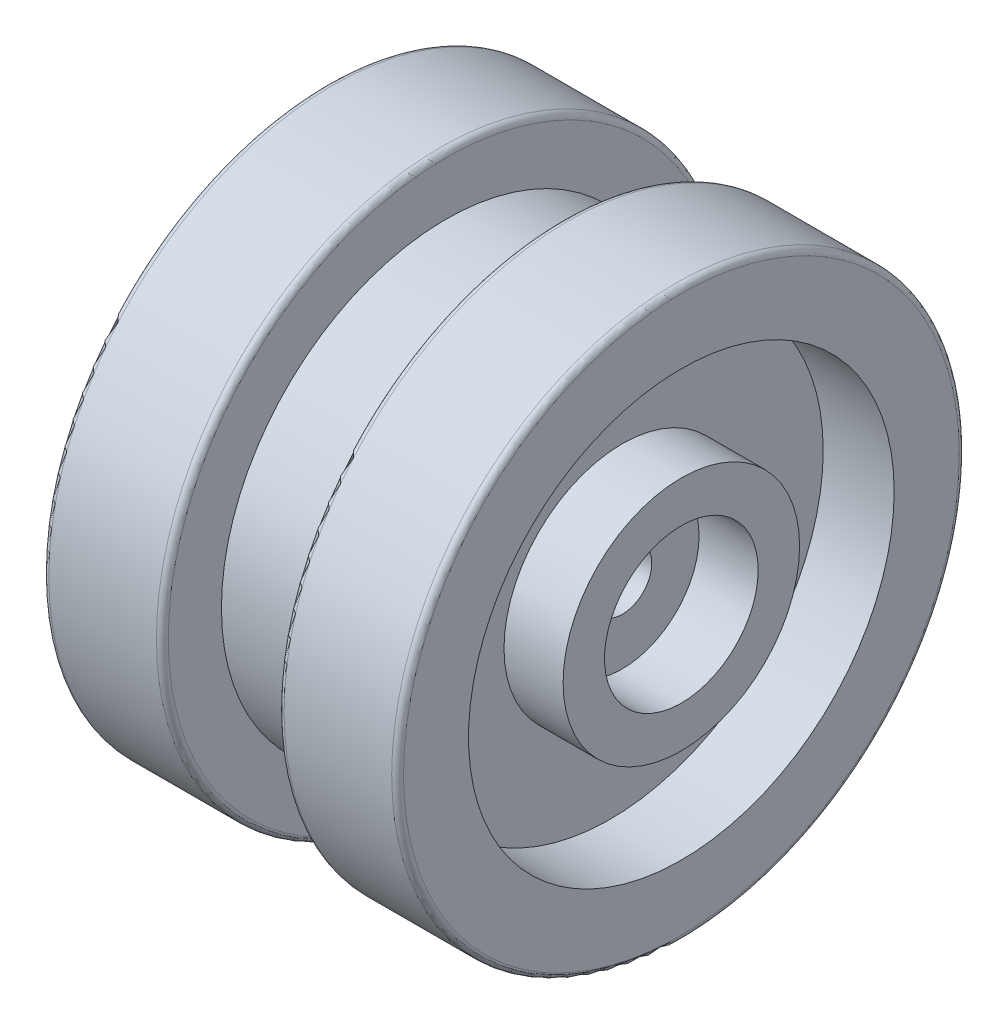
ISO-10303-21;
HEADER;
FILE_DESCRIPTION(('STEP AP214'),'2;1');
FILE_NAME('part.step','',(''),(''),'','','');
FILE_SCHEMA(('AUTOMOTIVE_DESIGN { 1 0 10303 214 1 1 1 1 }'));
ENDSEC;
DATA;
#1=APPLICATION_CONTEXT('core data for automotive mechanical design processes');
#2=APPLICATION_PROTOCOL_DEFINITION('international standard','automotive_design',2000,#1);
#3=PRODUCT_CONTEXT('',#1,'mechanical');
#4=PRODUCT('Part','Part','',(#3));
#5=PRODUCT_RELATED_PRODUCT_CATEGORY('part','',(#4));
#6=PRODUCT_DEFINITION_FORMATION('','',#4);
#7=PRODUCT_DEFINITION_CONTEXT('part definition',#1,'design');
#8=PRODUCT_DEFINITION('design','',#6,#7);
#9=PRODUCT_DEFINITION_SHAPE('','',#8);
#10=(LENGTH_UNIT() NAMED_UNIT(*) SI_UNIT(.MILLI.,.METRE.));
#11=(NAMED_UNIT(*) PLANE_ANGLE_UNIT() SI_UNIT($,.RADIAN.));
#12=(NAMED_UNIT(*) SI_UNIT($,.STERADIAN.) SOLID_ANGLE_UNIT());
#13=UNCERTAINTY_MEASURE_WITH_UNIT(LENGTH_MEASURE(1.E-05),#10,'distance_accuracy_value','');
#14=(GEOMETRIC_REPRESENTATION_CONTEXT(3) GLOBAL_UNCERTAINTY_ASSIGNED_CONTEXT((#13)) GLOBAL_UNIT_ASSIGNED_CONTEXT((#10,
#11,#12)) REPRESENTATION_CONTEXT('',''));
#15=CARTESIAN_POINT('',(0.,0.,0.));
#16=DIRECTION('',(0.,0.,1.));
#17=DIRECTION('',(1.,0.,0.));
#18=AXIS2_PLACEMENT_3D('',#15,#16,#17);
#19=CARTESIAN_POINT('',(7.33479912463906,-18.4842605379604,0.));
#20=DIRECTION('',(1.,0.,0.));
#21=DIRECTION('',(0.,0.,-1.));
#22=AXIS2_PLACEMENT_3D('',#19,#20,#21);
#23=CYLINDRICAL_SURFACE('',#22,8.);
#24=CARTESIAN_POINT('',(11.3347991246391,-18.4842605379604,0.));
#25=DIRECTION('',(1.,0.,0.));
#26=DIRECTION('',(0.,0.,-1.));
#27=AXIS2_PLACEMENT_3D('',#24,#25,#26);
#28=CIRCLE('',#27,8.);
#29=CARTESIAN_POINT('',(11.3347991246391,-18.4842605379604,-8.));
#30=VERTEX_POINT('',#29);
#31=EDGE_CURVE('E10',#30,#30,#28,.T.);
#32=ORIENTED_EDGE('',*,*,#31,.T.);
#33=EDGE_LOOP('',(#32));
#34=FACE_BOUND('',#33,.T.);
#35=CARTESIAN_POINT('',(12.3347991246391,-18.4842605379604,0.));
#36=DIRECTION('',(1.,0.,0.));
#37=DIRECTION('',(0.,0.,-1.));
#38=AXIS2_PLACEMENT_3D('',#35,#36,#37);
#39=CIRCLE('',#38,8.);
#40=CARTESIAN_POINT('',(12.3347991246391,-18.4842605379604,-8.));
#41=VERTEX_POINT('',#40);
#42=EDGE_CURVE('E55',#41,#41,#39,.F.);
#43=ORIENTED_EDGE('',*,*,#42,.T.);
#44=EDGE_LOOP('',(#43));
#45=FACE_BOUND('',#44,.T.);
#46=ADVANCED_FACE('F39',(#34,#45),#23,.T.);
#47=CARTESIAN_POINT('',(-2.56520087536094,0.515739462039643,0.));
#48=DIRECTION('',(-1.,0.,0.));
#49=DIRECTION('',(0.,0.,1.));
#50=AXIS2_PLACEMENT_3D('',#47,#48,#49);
#51=PLANE('',#50);
#52=CARTESIAN_POINT('',(-2.56520087536094,-18.4842605379604,0.));
#53=DIRECTION('',(-1.,0.,0.));
#54=DIRECTION('',(0.,0.,1.));
#55=AXIS2_PLACEMENT_3D('',#52,#53,#54);
#56=CIRCLE('',#55,23.5);
#57=CARTESIAN_POINT('',(-2.56520087536094,-18.4842605379604,23.5));
#58=VERTEX_POINT('',#57);
#59=EDGE_CURVE('E52',#58,#58,#56,.F.);
#60=ORIENTED_EDGE('',*,*,#59,.T.);
#61=EDGE_LOOP('',(#60));
#62=FACE_BOUND('',#61,.T.);
#63=CARTESIAN_POINT('',(-2.56520087536094,-18.4842605379604,0.));
#64=DIRECTION('',(-1.,0.,0.));
#65=DIRECTION('',(0.,0.,1.));
#66=AXIS2_PLACEMENT_3D('',#63,#64,#65);
#67=CIRCLE('',#66,19.);
#68=CARTESIAN_POINT('',(-2.56520087536094,-18.4842605379604,19.));
#69=VERTEX_POINT('',#68);
#70=EDGE_CURVE('E94',#69,#69,#67,.T.);
#71=ORIENTED_EDGE('',*,*,#70,.T.);
#72=EDGE_LOOP('',(#71));
#73=FACE_BOUND('',#72,.T.);
#74=ADVANCED_FACE('F122',(#62,#73),#51,.F.);
#75=CARTESIAN_POINT('',(-12.6652008753609,-18.4842605379604,0.));
#76=DIRECTION('',(-1.,0.,0.));
#77=DIRECTION('',(0.,0.,1.));
#78=AXIS2_PLACEMENT_3D('',#75,#76,#77);
#79=CYLINDRICAL_SURFACE('',#78,24.);
#80=CARTESIAN_POINT('',(-12.1652008753609,-18.4842605379604,0.));
#81=DIRECTION('',(1.,0.,0.));
#82=DIRECTION('',(0.,0.,-1.));
#83=AXIS2_PLACEMENT_3D('',#80,#81,#82);
#84=CIRCLE('',#83,24.);
#85=CARTESIAN_POINT('',(-12.1652008753609,-18.4842605379604,-24.));
#86=VERTEX_POINT('',#85);
#87=EDGE_CURVE('E117',#86,#86,#84,.T.);
#88=ORIENTED_EDGE('',*,*,#87,.T.);
#89=EDGE_LOOP('',(#88));
#90=FACE_BOUND('',#89,.T.);
#91=CARTESIAN_POINT('',(-3.06520087536094,-18.4842605379604,0.));
#92=DIRECTION('',(-1.,0.,0.));
#93=DIRECTION('',(0.,0.,1.));
#94=AXIS2_PLACEMENT_3D('',#91,#92,#93);
#95=CIRCLE('',#94,24.);
#96=CARTESIAN_POINT('',(-3.06520087536094,-18.4842605379604,24.));
#97=VERTEX_POINT('',#96);
#98=EDGE_CURVE('E114',#97,#97,#95,.T.);
#99=ORIENTED_EDGE('',*,*,#98,.T.);
#100=EDGE_LOOP('',(#99));
#101=FACE_BOUND('',#100,.T.);
#102=ADVANCED_FACE('F131',(#90,#101),#79,.T.);
#103=CARTESIAN_POINT('',(-12.6652008753609,5.51573946203964,0.));
#104=DIRECTION('',(1.,0.,0.));
#105=DIRECTION('',(0.,0.,-1.));
#106=AXIS2_PLACEMENT_3D('',#103,#104,#105);
#107=PLANE('',#106);
#108=CARTESIAN_POINT('',(-12.6652008753609,-18.4842605379604,0.));
#109=DIRECTION('',(-1.,0.,0.));
#110=DIRECTION('',(0.,0.,1.));
#111=AXIS2_PLACEMENT_3D('',#108,#109,#110);
#112=CIRCLE('',#111,18.);
#113=CARTESIAN_POINT('',(-12.6652008753609,-18.4842605379604,18.));
#114=VERTEX_POINT('',#113);
#115=EDGE_CURVE('E82',#114,#114,#112,.T.);
#116=ORIENTED_EDGE('',*,*,#115,.F.);
#117=EDGE_LOOP('',(#116));
#118=FACE_BOUND('',#117,.T.);
#119=CARTESIAN_POINT('',(-12.6652008753609,-18.4842605379604,0.));
#120=DIRECTION('',(1.,0.,0.));
#121=DIRECTION('',(0.,0.,-1.));
#122=AXIS2_PLACEMENT_3D('',#119,#120,#121);
#123=CIRCLE('',#122,23.5);
#124=CARTESIAN_POINT('',(-12.6652008753609,-18.4842605379604,-23.5));
#125=VERTEX_POINT('',#124);
#126=EDGE_CURVE('E111',#125,#125,#123,.F.);
#127=ORIENTED_EDGE('',*,*,#126,.T.);
#128=EDGE_LOOP('',(#127));
#129=FACE_BOUND('',#128,.T.);
#130=ADVANCED_FACE('F133',(#118,#129),#107,.F.);
#131=CARTESIAN_POINT('',(17.3347991246391,-18.4842605379604,0.));
#132=DIRECTION('',(-1.,0.,0.));
#133=DIRECTION('',(0.,0.,1.));
#134=AXIS2_PLACEMENT_3D('',#131,#132,#133);
#135=PLANE('',#134);
#136=CARTESIAN_POINT('',(17.3347991246391,-18.4842605379604,0.));
#137=DIRECTION('',(1.,0.,0.));
#138=DIRECTION('',(0.,0.,-1.));
#139=AXIS2_PLACEMENT_3D('',#136,#137,#138);
#140=CIRCLE('',#139,18.);
#141=CARTESIAN_POINT('',(17.3347991246391,-18.4842605379604,-18.));
#142=VERTEX_POINT('',#141);
#143=EDGE_CURVE('E88',#142,#142,#140,.T.);
#144=ORIENTED_EDGE('',*,*,#143,.F.);
#145=EDGE_LOOP('',(#144));
#146=FACE_BOUND('',#145,.T.);
#147=CARTESIAN_POINT('',(17.3347991246391,-18.4842605379604,0.));
#148=DIRECTION('',(-1.,0.,0.));
#149=DIRECTION('',(0.,0.,1.));
#150=AXIS2_PLACEMENT_3D('',#147,#148,#149);
#151=CIRCLE('',#150,23.5);
#152=CARTESIAN_POINT('',(17.3347991246391,-18.4842605379604,23.5));
#153=VERTEX_POINT('',#152);
#154=EDGE_CURVE('E108',#153,#153,#151,.F.);
#155=ORIENTED_EDGE('',*,*,#154,.T.);
#156=EDGE_LOOP('',(#155));
#157=FACE_BOUND('',#156,.T.);
#158=ADVANCED_FACE('F141',(#146,#157),#135,.F.);
#159=CARTESIAN_POINT('',(-12.6652008753609,-18.4842605379604,0.));
#160=DIRECTION('',(-1.,0.,0.));
#161=DIRECTION('',(0.,0.,1.));
#162=AXIS2_PLACEMENT_3D('',#159,#160,#161);
#163=CYLINDRICAL_SURFACE('',#162,24.);
#164=CARTESIAN_POINT('',(16.8347991246391,-18.4842605379604,0.));
#165=DIRECTION('',(-1.,0.,0.));
#166=DIRECTION('',(0.,0.,1.));
#167=AXIS2_PLACEMENT_3D('',#164,#165,#166);
#168=CIRCLE('',#167,24.);
#169=CARTESIAN_POINT('',(16.8347991246391,-18.4842605379604,24.));
#170=VERTEX_POINT('',#169);
#171=EDGE_CURVE('E105',#170,#170,#168,.T.);
#172=ORIENTED_EDGE('',*,*,#171,.T.);
#173=EDGE_LOOP('',(#172));
#174=FACE_BOUND('',#173,.T.);
#175=CARTESIAN_POINT('',(7.73479912463906,-18.4842605379604,0.));
#176=DIRECTION('',(1.,0.,0.));
#177=DIRECTION('',(0.,0.,-1.));
#178=AXIS2_PLACEMENT_3D('',#175,#176,#177);
#179=CIRCLE('',#178,24.);
#180=CARTESIAN_POINT('',(7.73479912463906,-18.4842605379604,-24.));
#181=VERTEX_POINT('',#180);
#182=EDGE_CURVE('E102',#181,#181,#179,.T.);
#183=ORIENTED_EDGE('',*,*,#182,.T.);
#184=EDGE_LOOP('',(#183));
#185=FACE_BOUND('',#184,.T.);
#186=ADVANCED_FACE('F187',(#174,#185),#163,.T.);
#187=CARTESIAN_POINT('',(7.23479912463906,0.515739462039643,0.));
#188=DIRECTION('',(1.,0.,0.));
#189=DIRECTION('',(0.,0.,-1.));
#190=AXIS2_PLACEMENT_3D('',#187,#188,#189);
#191=PLANE('',#190);
#192=CARTESIAN_POINT('',(7.23479912463906,-18.4842605379604,0.));
#193=DIRECTION('',(1.,0.,0.));
#194=DIRECTION('',(0.,0.,-1.));
#195=AXIS2_PLACEMENT_3D('',#192,#193,#194);
#196=CIRCLE('',#195,23.5);
#197=CARTESIAN_POINT('',(7.23479912463906,-18.4842605379604,-23.5));
#198=VERTEX_POINT('',#197);
#199=EDGE_CURVE('E47',#198,#198,#196,.F.);
#200=ORIENTED_EDGE('',*,*,#199,.T.);
#201=EDGE_LOOP('',(#200));
#202=FACE_BOUND('',#201,.T.);
#203=CARTESIAN_POINT('',(7.23479912463906,-18.4842605379604,0.));
#204=DIRECTION('',(-1.,0.,0.));
#205=DIRECTION('',(0.,0.,1.));
#206=AXIS2_PLACEMENT_3D('',#203,#204,#205);
#207=CIRCLE('',#206,19.);
#208=CARTESIAN_POINT('',(7.23479912463906,-18.4842605379604,19.));
#209=VERTEX_POINT('',#208);
#210=EDGE_CURVE('E99',#209,#209,#207,.T.);
#211=ORIENTED_EDGE('',*,*,#210,.F.);
#212=EDGE_LOOP('',(#211));
#213=FACE_BOUND('',#212,.T.);
#214=ADVANCED_FACE('F183',(#202,#213),#191,.F.);
#215=CARTESIAN_POINT('',(-12.6652008753609,-18.4842605379604,0.));
#216=DIRECTION('',(-1.,0.,0.));
#217=DIRECTION('',(0.,0.,1.));
#218=AXIS2_PLACEMENT_3D('',#215,#216,#217);
#219=CYLINDRICAL_SURFACE('',#218,19.);
#220=ORIENTED_EDGE('',*,*,#70,.F.);
#221=EDGE_LOOP('',(#220));
#222=FACE_BOUND('',#221,.T.);
#223=ORIENTED_EDGE('',*,*,#210,.T.);
#224=EDGE_LOOP('',(#223));
#225=FACE_BOUND('',#224,.T.);
#226=ADVANCED_FACE('F179',(#222,#225),#219,.T.);
#227=CARTESIAN_POINT('',(16.8347991246391,-18.4842605379604,0.));
#228=DIRECTION('',(-1.,0.,0.));
#229=DIRECTION('',(0.,0.,1.));
#230=AXIS2_PLACEMENT_3D('',#227,#228,#229);
#231=TOROIDAL_SURFACE('',#230,23.5,0.5);
#232=ORIENTED_EDGE('',*,*,#154,.F.);
#233=EDGE_LOOP('',(#232));
#234=FACE_BOUND('',#233,.T.);
#235=ORIENTED_EDGE('',*,*,#171,.F.);
#236=EDGE_LOOP('',(#235));
#237=FACE_BOUND('',#236,.T.);
#238=ADVANCED_FACE('F182',(#234,#237),#231,.T.);
#239=CARTESIAN_POINT('',(-12.1652008753609,-18.4842605379604,0.));
#240=DIRECTION('',(1.,0.,0.));
#241=DIRECTION('',(0.,0.,-1.));
#242=AXIS2_PLACEMENT_3D('',#239,#240,#241);
#243=TOROIDAL_SURFACE('',#242,23.5,0.5);
#244=ORIENTED_EDGE('',*,*,#87,.F.);
#245=EDGE_LOOP('',(#244));
#246=FACE_BOUND('',#245,.T.);
#247=ORIENTED_EDGE('',*,*,#126,.F.);
#248=EDGE_LOOP('',(#247));
#249=FACE_BOUND('',#248,.T.);
#250=ADVANCED_FACE('F128',(#246,#249),#243,.T.);
#251=CARTESIAN_POINT('',(-3.06520087536094,-18.4842605379604,0.));
#252=DIRECTION('',(-1.,0.,0.));
#253=DIRECTION('',(0.,0.,1.));
#254=AXIS2_PLACEMENT_3D('',#251,#252,#253);
#255=TOROIDAL_SURFACE('',#254,23.5,0.5);
#256=ORIENTED_EDGE('',*,*,#59,.F.);
#257=EDGE_LOOP('',(#256));
#258=FACE_BOUND('',#257,.T.);
#259=ORIENTED_EDGE('',*,*,#98,.F.);
#260=EDGE_LOOP('',(#259));
#261=FACE_BOUND('',#260,.T.);
#262=ADVANCED_FACE('F125',(#258,#261),#255,.T.);
#263=CARTESIAN_POINT('',(7.73479912463906,-18.4842605379604,0.));
#264=DIRECTION('',(1.,0.,0.));
#265=DIRECTION('',(0.,0.,-1.));
#266=AXIS2_PLACEMENT_3D('',#263,#264,#265);
#267=TOROIDAL_SURFACE('',#266,23.5,0.5);
#268=ORIENTED_EDGE('',*,*,#182,.F.);
#269=EDGE_LOOP('',(#268));
#270=FACE_BOUND('',#269,.T.);
#271=ORIENTED_EDGE('',*,*,#199,.F.);
#272=EDGE_LOOP('',(#271));
#273=FACE_BOUND('',#272,.T.);
#274=ADVANCED_FACE('F41',(#270,#273),#267,.T.);
#275=CARTESIAN_POINT('',(11.3347991246391,-18.4842605379604,0.));
#276=DIRECTION('',(1.,0.,0.));
#277=DIRECTION('',(0.,0.,-1.));
#278=AXIS2_PLACEMENT_3D('',#275,#276,#277);
#279=CYLINDRICAL_SURFACE('',#278,18.);
#280=CARTESIAN_POINT('',(11.3347991246391,-18.4842605379604,0.));
#281=DIRECTION('',(1.,0.,0.));
#282=DIRECTION('',(0.,0.,-1.));
#283=AXIS2_PLACEMENT_3D('',#280,#281,#282);
#284=CIRCLE('',#283,18.);
#285=CARTESIAN_POINT('',(11.3347991246391,-18.4842605379604,-18.));
#286=VERTEX_POINT('',#285);
#287=EDGE_CURVE('E91',#286,#286,#284,.T.);
#288=ORIENTED_EDGE('',*,*,#287,.F.);
#289=EDGE_LOOP('',(#288));
#290=FACE_BOUND('',#289,.T.);
#291=ORIENTED_EDGE('',*,*,#143,.T.);
#292=EDGE_LOOP('',(#291));
#293=FACE_BOUND('',#292,.T.);
#294=ADVANCED_FACE('F174',(#290,#293),#279,.F.);
#295=CARTESIAN_POINT('',(11.3347991246391,-18.4842605379604,0.));
#296=DIRECTION('',(1.,0.,0.));
#297=DIRECTION('',(0.,0.,-1.));
#298=AXIS2_PLACEMENT_3D('',#295,#296,#297);
#299=PLANE('',#298);
#300=ORIENTED_EDGE('',*,*,#31,.F.);
#301=EDGE_LOOP('',(#300));
#302=FACE_BOUND('',#301,.T.);
#303=ORIENTED_EDGE('',*,*,#287,.T.);
#304=EDGE_LOOP('',(#303));
#305=FACE_BOUND('',#304,.T.);
#306=ADVANCED_FACE('F167',(#302,#305),#299,.T.);
#307=CARTESIAN_POINT('',(-6.66520087536094,-18.4842605379604,0.));
#308=DIRECTION('',(-1.,0.,0.));
#309=DIRECTION('',(0.,0.,1.));
#310=AXIS2_PLACEMENT_3D('',#307,#308,#309);
#311=PLANE('',#310);
#312=CARTESIAN_POINT('',(-6.66520087536094,-18.4842605379604,0.));
#313=DIRECTION('',(-1.,0.,0.));
#314=DIRECTION('',(0.,0.,1.));
#315=AXIS2_PLACEMENT_3D('',#312,#313,#314);
#316=CIRCLE('',#315,10.);
#317=CARTESIAN_POINT('',(-6.66520087536094,-18.4842605379604,10.));
#318=VERTEX_POINT('',#317);
#319=EDGE_CURVE('E77',#318,#318,#316,.T.);
#320=ORIENTED_EDGE('',*,*,#319,.F.);
#321=EDGE_LOOP('',(#320));
#322=FACE_BOUND('',#321,.T.);
#323=CARTESIAN_POINT('',(-6.66520087536094,-18.4842605379604,0.));
#324=DIRECTION('',(-1.,0.,0.));
#325=DIRECTION('',(0.,0.,1.));
#326=AXIS2_PLACEMENT_3D('',#323,#324,#325);
#327=CIRCLE('',#326,18.);
#328=CARTESIAN_POINT('',(-6.66520087536094,-18.4842605379604,18.));
#329=VERTEX_POINT('',#328);
#330=EDGE_CURVE('E85',#329,#329,#327,.T.);
#331=ORIENTED_EDGE('',*,*,#330,.T.);
#332=EDGE_LOOP('',(#331));
#333=FACE_BOUND('',#332,.T.);
#334=ADVANCED_FACE('F164',(#322,#333),#311,.T.);
#335=CARTESIAN_POINT('',(-6.66520087536094,-18.4842605379604,0.));
#336=DIRECTION('',(-1.,0.,0.));
#337=DIRECTION('',(0.,0.,1.));
#338=AXIS2_PLACEMENT_3D('',#335,#336,#337);
#339=CYLINDRICAL_SURFACE('',#338,18.);
#340=ORIENTED_EDGE('',*,*,#330,.F.);
#341=EDGE_LOOP('',(#340));
#342=FACE_BOUND('',#341,.T.);
#343=ORIENTED_EDGE('',*,*,#115,.T.);
#344=EDGE_LOOP('',(#343));
#345=FACE_BOUND('',#344,.T.);
#346=ADVANCED_FACE('F159',(#342,#345),#339,.F.);
#347=CARTESIAN_POINT('',(-12.6652008753609,-18.4842605379604,0.));
#348=DIRECTION('',(-1.,0.,0.));
#349=DIRECTION('',(0.,0.,1.));
#350=AXIS2_PLACEMENT_3D('',#347,#348,#349);
#351=PLANE('',#350);
#352=CARTESIAN_POINT('',(-12.6652008753609,-18.4842605379604,0.));
#353=DIRECTION('',(-1.,0.,0.));
#354=DIRECTION('',(0.,0.,1.));
#355=AXIS2_PLACEMENT_3D('',#352,#353,#354);
#356=CIRCLE('',#355,6.5);
#357=CARTESIAN_POINT('',(-12.6652008753609,-18.4842605379604,6.5));
#358=VERTEX_POINT('',#357);
#359=EDGE_CURVE('E57',#358,#358,#356,.T.);
#360=ORIENTED_EDGE('',*,*,#359,.F.);
#361=EDGE_LOOP('',(#360));
#362=FACE_BOUND('',#361,.T.);
#363=CARTESIAN_POINT('',(-12.6652008753609,-18.4842605379604,0.));
#364=DIRECTION('',(-1.,0.,0.));
#365=DIRECTION('',(0.,0.,1.));
#366=AXIS2_PLACEMENT_3D('',#363,#364,#365);
#367=CIRCLE('',#366,10.);
#368=CARTESIAN_POINT('',(-12.6652008753609,-18.4842605379604,10.));
#369=VERTEX_POINT('',#368);
#370=EDGE_CURVE('E79',#369,#369,#367,.T.);
#371=ORIENTED_EDGE('',*,*,#370,.T.);
#372=EDGE_LOOP('',(#371));
#373=FACE_BOUND('',#372,.T.);
#374=ADVANCED_FACE('F155',(#362,#373),#351,.T.);
#375=CARTESIAN_POINT('',(-12.6652008753609,-18.4842605379604,0.));
#376=DIRECTION('',(1.,0.,0.));
#377=DIRECTION('',(0.,0.,-1.));
#378=AXIS2_PLACEMENT_3D('',#375,#376,#377);
#379=CYLINDRICAL_SURFACE('',#378,10.);
#380=ORIENTED_EDGE('',*,*,#370,.F.);
#381=EDGE_LOOP('',(#380));
#382=FACE_BOUND('',#381,.T.);
#383=ORIENTED_EDGE('',*,*,#319,.T.);
#384=EDGE_LOOP('',(#383));
#385=FACE_BOUND('',#384,.T.);
#386=ADVANCED_FACE('F158',(#382,#385),#379,.T.);
#387=CARTESIAN_POINT('',(-7.66520087536094,-18.4842605379604,0.));
#388=DIRECTION('',(-1.,0.,0.));
#389=DIRECTION('',(0.,0.,1.));
#390=AXIS2_PLACEMENT_3D('',#387,#388,#389);
#391=CYLINDRICAL_SURFACE('',#390,6.5);
#392=CARTESIAN_POINT('',(-7.66520087536094,-18.4842605379604,0.));
#393=DIRECTION('',(-1.,0.,0.));
#394=DIRECTION('',(0.,0.,1.));
#395=AXIS2_PLACEMENT_3D('',#392,#393,#394);
#396=CIRCLE('',#395,6.5);
#397=CARTESIAN_POINT('',(-7.66520087536094,-18.4842605379604,6.5));
#398=VERTEX_POINT('',#397);
#399=EDGE_CURVE('E62',#398,#398,#396,.T.);
#400=ORIENTED_EDGE('',*,*,#399,.F.);
#401=EDGE_LOOP('',(#400));
#402=FACE_BOUND('',#401,.T.);
#403=ORIENTED_EDGE('',*,*,#359,.T.);
#404=EDGE_LOOP('',(#403));
#405=FACE_BOUND('',#404,.T.);
#406=ADVANCED_FACE('F153',(#402,#405),#391,.F.);
#407=CARTESIAN_POINT('',(-7.66520087536094,-18.4842605379604,0.));
#408=DIRECTION('',(-1.,0.,0.));
#409=DIRECTION('',(0.,0.,1.));
#410=AXIS2_PLACEMENT_3D('',#407,#408,#409);
#411=PLANE('',#410);
#412=CARTESIAN_POINT('',(-7.66520087536094,-18.4842605379604,0.));
#413=DIRECTION('',(-1.,0.,0.));
#414=DIRECTION('',(0.,0.,1.));
#415=AXIS2_PLACEMENT_3D('',#412,#413,#414);
#416=CIRCLE('',#415,2.5);
#417=CARTESIAN_POINT('',(-7.66520087536094,-18.4842605379604,2.5));
#418=VERTEX_POINT('',#417);
#419=EDGE_CURVE('E236',#418,#418,#416,.T.);
#420=ORIENTED_EDGE('',*,*,#419,.F.);
#421=EDGE_LOOP('',(#420));
#422=FACE_BOUND('',#421,.T.);
#423=ORIENTED_EDGE('',*,*,#399,.T.);
#424=EDGE_LOOP('',(#423));
#425=FACE_BOUND('',#424,.T.);
#426=ADVANCED_FACE('F218',(#422,#425),#411,.T.);
#427=CARTESIAN_POINT('',(12.3347991246391,-18.4842605379604,0.));
#428=DIRECTION('',(1.,0.,0.));
#429=DIRECTION('',(0.,0.,-1.));
#430=AXIS2_PLACEMENT_3D('',#427,#428,#429);
#431=CYLINDRICAL_SURFACE('',#430,10.);
#432=CARTESIAN_POINT('',(12.3347991246391,-18.4842605379604,0.));
#433=DIRECTION('',(1.,0.,0.));
#434=DIRECTION('',(0.,0.,-1.));
#435=AXIS2_PLACEMENT_3D('',#432,#433,#434);
#436=CIRCLE('',#435,10.);
#437=CARTESIAN_POINT('',(12.3347991246391,-18.4842605379604,-10.));
#438=VERTEX_POINT('',#437);
#439=EDGE_CURVE('E58',#438,#438,#436,.T.);
#440=ORIENTED_EDGE('',*,*,#439,.T.);
#441=EDGE_LOOP('',(#440));
#442=FACE_BOUND('',#441,.T.);
#443=CARTESIAN_POINT('',(17.3347991246391,-18.4842605379604,0.));
#444=DIRECTION('',(1.,0.,0.));
#445=DIRECTION('',(0.,0.,-1.));
#446=AXIS2_PLACEMENT_3D('',#443,#444,#445);
#447=CIRCLE('',#446,10.);
#448=CARTESIAN_POINT('',(17.3347991246391,-18.4842605379604,-10.));
#449=VERTEX_POINT('',#448);
#450=EDGE_CURVE('E65',#449,#449,#447,.T.);
#451=ORIENTED_EDGE('',*,*,#450,.F.);
#452=EDGE_LOOP('',(#451));
#453=FACE_BOUND('',#452,.T.);
#454=ADVANCED_FACE('F210',(#442,#453),#431,.T.);
#455=CARTESIAN_POINT('',(12.3347991246391,-18.4842605379604,0.));
#456=DIRECTION('',(1.,0.,0.));
#457=DIRECTION('',(0.,0.,-1.));
#458=AXIS2_PLACEMENT_3D('',#455,#456,#457);
#459=PLANE('',#458);
#460=ORIENTED_EDGE('',*,*,#42,.F.);
#461=EDGE_LOOP('',(#460));
#462=FACE_BOUND('',#461,.T.);
#463=ORIENTED_EDGE('',*,*,#439,.F.);
#464=EDGE_LOOP('',(#463));
#465=FACE_BOUND('',#464,.T.);
#466=ADVANCED_FACE('F201',(#462,#465),#459,.F.);
#467=CARTESIAN_POINT('',(17.3347991246391,-18.4842605379604,0.));
#468=DIRECTION('',(1.,0.,0.));
#469=DIRECTION('',(0.,0.,-1.));
#470=AXIS2_PLACEMENT_3D('',#467,#468,#469);
#471=CIRCLE('',#470,6.5);
#472=CARTESIAN_POINT('',(17.3347991246391,-18.4842605379604,-6.5));
#473=VERTEX_POINT('',#472);
#474=EDGE_CURVE('E73',#473,#473,#471,.T.);
#475=ORIENTED_EDGE('',*,*,#474,.F.);
#476=EDGE_LOOP('',(#475));
#477=FACE_BOUND('',#476,.T.);
#478=ORIENTED_EDGE('',*,*,#450,.T.);
#479=EDGE_LOOP('',(#478));
#480=FACE_BOUND('',#479,.T.);
#481=ADVANCED_FACE('F193',(#477,#480),#135,.F.);
#482=CARTESIAN_POINT('',(12.3347991246391,-18.4842605379604,0.));
#483=DIRECTION('',(1.,0.,0.));
#484=DIRECTION('',(0.,0.,-1.));
#485=AXIS2_PLACEMENT_3D('',#482,#483,#484);
#486=CYLINDRICAL_SURFACE('',#485,6.5);
#487=CARTESIAN_POINT('',(12.3347991246391,-18.4842605379604,0.));
#488=DIRECTION('',(1.,0.,0.));
#489=DIRECTION('',(0.,0.,-1.));
#490=AXIS2_PLACEMENT_3D('',#487,#488,#489);
#491=CIRCLE('',#490,6.5);
#492=CARTESIAN_POINT('',(12.3347991246391,-18.4842605379604,-6.5));
#493=VERTEX_POINT('',#492);
#494=EDGE_CURVE('E70',#493,#493,#491,.T.);
#495=ORIENTED_EDGE('',*,*,#494,.F.);
#496=EDGE_LOOP('',(#495));
#497=FACE_BOUND('',#496,.T.);
#498=ORIENTED_EDGE('',*,*,#474,.T.);
#499=EDGE_LOOP('',(#498));
#500=FACE_BOUND('',#499,.T.);
#501=ADVANCED_FACE('F200',(#497,#500),#486,.F.);
#502=CARTESIAN_POINT('',(12.3347991246391,-18.4842605379604,0.));
#503=DIRECTION('',(1.,0.,0.));
#504=DIRECTION('',(0.,0.,-1.));
#505=AXIS2_PLACEMENT_3D('',#502,#503,#504);
#506=PLANE('',#505);
#507=CARTESIAN_POINT('',(12.3347991246391,-18.4842605379604,0.));
#508=DIRECTION('',(1.,0.,0.));
#509=DIRECTION('',(0.,0.,-1.));
#510=AXIS2_PLACEMENT_3D('',#507,#508,#509);
#511=CIRCLE('',#510,2.5);
#512=CARTESIAN_POINT('',(12.3347991246391,-18.4842605379604,2.5));
#513=VERTEX_POINT('',#512);
#514=EDGE_CURVE('E43',#513,#513,#511,.T.);
#515=ORIENTED_EDGE('',*,*,#514,.F.);
#516=EDGE_LOOP('',(#515));
#517=FACE_BOUND('',#516,.T.);
#518=ORIENTED_EDGE('',*,*,#494,.T.);
#519=EDGE_LOOP('',(#518));
#520=FACE_BOUND('',#519,.T.);
#521=ADVANCED_FACE('F207',(#517,#520),#506,.T.);
#522=CARTESIAN_POINT('',(17.3347991246391,-18.4842605379604,0.));
#523=DIRECTION('',(-1.,0.,0.));
#524=DIRECTION('',(0.,0.,1.));
#525=AXIS2_PLACEMENT_3D('',#522,#523,#524);
#526=CYLINDRICAL_SURFACE('',#525,2.5);
#527=CARTESIAN_POINT('',(-7.66520087536094,-18.4842605379604,2.5));
#528=CARTESIAN_POINT('',(-7.4568675420276,-18.4842605379604,2.5));
#529=CARTESIAN_POINT('',(-7.24853420869427,-18.4842605379604,2.5));
#530=CARTESIAN_POINT('',(-6.8318675420276,-18.4842605379604,2.5));
#531=CARTESIAN_POINT('',(-6.62353420869427,-18.4842605379604,2.5));
#532=CARTESIAN_POINT('',(-6.2068675420276,-18.4842605379604,2.5));
#533=CARTESIAN_POINT('',(-5.99853420869427,-18.4842605379604,2.5));
#534=CARTESIAN_POINT('',(-5.5818675420276,-18.4842605379604,2.5));
#535=CARTESIAN_POINT('',(-5.37353420869427,-18.4842605379604,2.5));
#536=CARTESIAN_POINT('',(-4.9568675420276,-18.4842605379604,2.5));
#537=CARTESIAN_POINT('',(-4.74853420869427,-18.4842605379604,2.5));
#538=CARTESIAN_POINT('',(-4.3318675420276,-18.4842605379604,2.5));
#539=CARTESIAN_POINT('',(-4.12353420869427,-18.4842605379604,2.5));
#540=CARTESIAN_POINT('',(-3.7068675420276,-18.4842605379604,2.5));
#541=CARTESIAN_POINT('',(-3.49853420869427,-18.4842605379604,2.5));
#542=CARTESIAN_POINT('',(-3.0818675420276,-18.4842605379604,2.5));
#543=CARTESIAN_POINT('',(-2.87353420869427,-18.4842605379604,2.5));
#544=CARTESIAN_POINT('',(-2.45686754202761,-18.4842605379604,2.5));
#545=CARTESIAN_POINT('',(-2.24853420869427,-18.4842605379604,2.5));
#546=CARTESIAN_POINT('',(-1.83186754202761,-18.4842605379604,2.5));
#547=CARTESIAN_POINT('',(-1.62353420869427,-18.4842605379604,2.5));
#548=CARTESIAN_POINT('',(-1.2068675420276,-18.4842605379604,2.5));
#549=CARTESIAN_POINT('',(-0.998534208694271,-18.4842605379604,2.5));
#550=CARTESIAN_POINT('',(-0.581867542027604,-18.4842605379604,2.5));
#551=CARTESIAN_POINT('',(-0.373534208694271,-18.4842605379604,2.5));
#552=CARTESIAN_POINT('',(0.0431324579723962,-18.4842605379604,2.5));
#553=CARTESIAN_POINT('',(0.25146579130573,-18.4842605379604,2.5));
#554=CARTESIAN_POINT('',(0.668132457972397,-18.4842605379604,2.5));
#555=CARTESIAN_POINT('',(0.87646579130573,-18.4842605379604,2.5));
#556=CARTESIAN_POINT('',(1.2931324579724,-18.4842605379604,2.5));
#557=CARTESIAN_POINT('',(1.50146579130573,-18.4842605379604,2.5));
#558=CARTESIAN_POINT('',(1.91813245797239,-18.4842605379604,2.5));
#559=CARTESIAN_POINT('',(2.12646579130573,-18.4842605379604,2.5));
#560=CARTESIAN_POINT('',(2.54313245797239,-18.4842605379604,2.5));
#561=CARTESIAN_POINT('',(2.75146579130573,-18.4842605379604,2.5));
#562=CARTESIAN_POINT('',(3.16813245797239,-18.4842605379604,2.5));
#563=CARTESIAN_POINT('',(3.37646579130573,-18.4842605379604,2.5));
#564=CARTESIAN_POINT('',(3.79313245797239,-18.4842605379604,2.5));
#565=CARTESIAN_POINT('',(4.00146579130573,-18.4842605379604,2.5));
#566=CARTESIAN_POINT('',(4.41813245797239,-18.4842605379604,2.5));
#567=CARTESIAN_POINT('',(4.62646579130573,-18.4842605379604,2.5));
#568=CARTESIAN_POINT('',(5.04313245797239,-18.4842605379604,2.5));
#569=CARTESIAN_POINT('',(5.25146579130573,-18.4842605379604,2.5));
#570=CARTESIAN_POINT('',(5.66813245797239,-18.4842605379604,2.5));
#571=CARTESIAN_POINT('',(5.87646579130573,-18.4842605379604,2.5));
#572=CARTESIAN_POINT('',(6.29313245797239,-18.4842605379604,2.5));
#573=CARTESIAN_POINT('',(6.50146579130573,-18.4842605379604,2.5));
#574=CARTESIAN_POINT('',(6.91813245797239,-18.4842605379604,2.5));
#575=CARTESIAN_POINT('',(7.12646579130573,-18.4842605379604,2.5));
#576=CARTESIAN_POINT('',(7.54313245797239,-18.4842605379604,2.5));
#577=CARTESIAN_POINT('',(7.75146579130573,-18.4842605379604,2.5));
#578=CARTESIAN_POINT('',(8.16813245797239,-18.4842605379604,2.5));
#579=CARTESIAN_POINT('',(8.37646579130572,-18.4842605379604,2.5));
#580=CARTESIAN_POINT('',(8.79313245797239,-18.4842605379604,2.5));
#581=CARTESIAN_POINT('',(9.00146579130573,-18.4842605379604,2.5));
#582=CARTESIAN_POINT('',(9.41813245797239,-18.4842605379604,2.5));
#583=CARTESIAN_POINT('',(9.62646579130572,-18.4842605379604,2.5));
#584=CARTESIAN_POINT('',(10.0431324579724,-18.4842605379604,2.5));
#585=CARTESIAN_POINT('',(10.2514657913057,-18.4842605379604,2.5));
#586=CARTESIAN_POINT('',(10.6681324579724,-18.4842605379604,2.5));
#587=CARTESIAN_POINT('',(10.8764657913057,-18.4842605379604,2.5));
#588=CARTESIAN_POINT('',(11.2931324579724,-18.4842605379604,2.5));
#589=CARTESIAN_POINT('',(11.5014657913057,-18.4842605379604,2.5));
#590=CARTESIAN_POINT('',(11.9181324579724,-18.4842605379604,2.5));
#591=CARTESIAN_POINT('',(12.1264657913057,-18.4842605379604,2.5));
#592=CARTESIAN_POINT('',(12.3347991246391,-18.4842605379604,2.5));
#593=B_SPLINE_CURVE_WITH_KNOTS('',3,(#527,#528,#529,#530,#531,#532,#533,#534,#535,#536,#537,
#538,#539,#540,#541,#542,#543,#544,#545,#546,#547,#548,#549,#550,#551,#552,#553,#554,#555,#556,
#557,#558,#559,#560,#561,#562,#563,#564,#565,#566,#567,#568,#569,#570,#571,#572,#573,#574,#575,
#576,#577,#578,#579,#580,#581,#582,#583,#584,#585,#586,#587,#588,#589,#590,#591,#592),
.UNSPECIFIED.,.F.,.F.,(4,2,2,2,2,2,2,2,2,2,2,2,2,2,2,2,2,2,2,2,2,2,2,2,2,2,2,2,2,2,2,2,4),(0.,
0.625000000000001,1.25,1.875,2.5,3.125,3.75,4.375,5.,5.625,6.25,6.875,7.5,8.125,8.75,9.375,10.,
10.625,11.25,11.875,12.5,13.125,13.75,14.375,15.,15.625,16.25,16.875,17.5,18.125,18.75,19.375,
20.),.UNSPECIFIED.);
#594=EDGE_CURVE('BSEAM227',#418,#513,#593,.T.);
#595=ORIENTED_EDGE('',*,*,#419,.T.);
#596=ORIENTED_EDGE('',*,*,#514,.T.);
#597=ORIENTED_EDGE('',*,*,#594,.T.);
#598=ORIENTED_EDGE('',*,*,#594,.F.);
#599=EDGE_LOOP('',(#595,#597,#596,#598));
#600=FACE_BOUND('',#599,.T.);
#601=ADVANCED_FACE('F227',(#600),#526,.F.);
#602=CLOSED_SHELL('',(#46,#74,#102,#130,#158,#186,#214,#226,#238,#250,#262,#274,#294,#306,#334,
#346,#374,#386,#406,#426,#454,#466,#481,#501,#521,#601));
#603=MANIFOLD_SOLID_BREP('B2',#602);
#604=ADVANCED_BREP_SHAPE_REPRESENTATION('',(#18,#603),#14);
#605=SHAPE_DEFINITION_REPRESENTATION(#9,#604);
ENDSEC;
END-ISO-10303-21;
